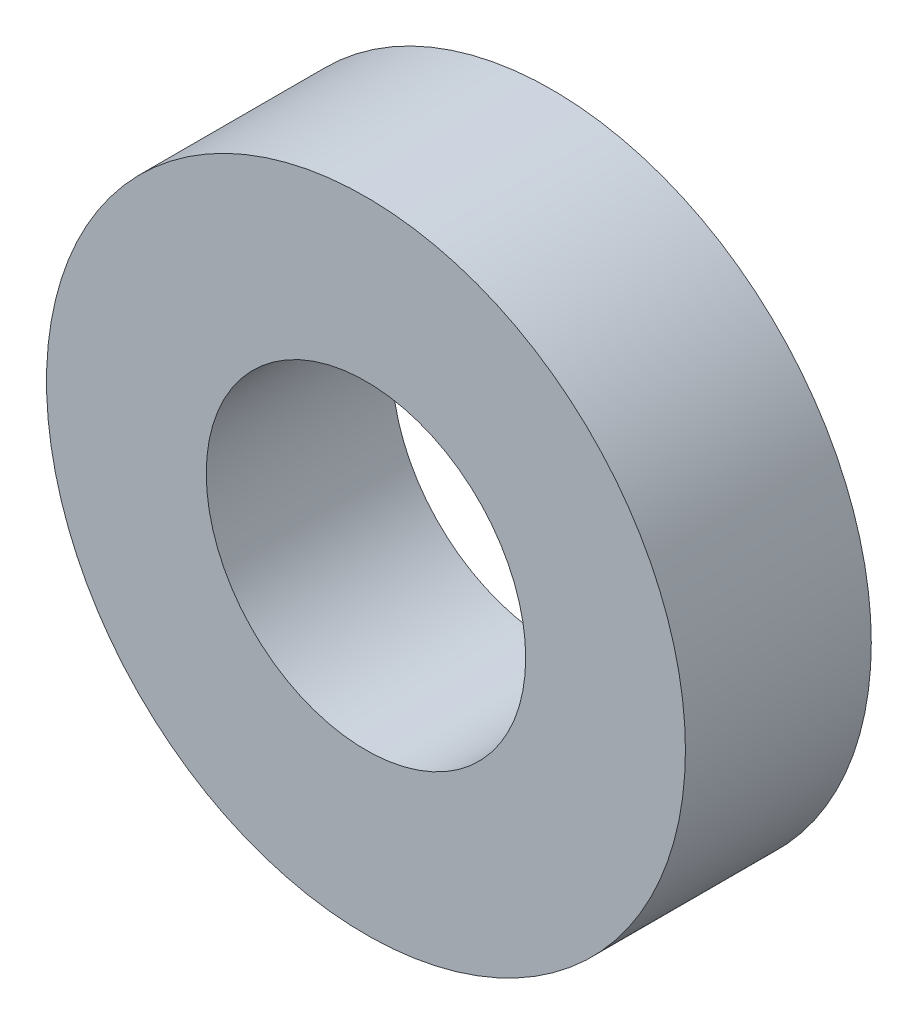
ISO-10303-21;
HEADER;
FILE_DESCRIPTION(('STEP AP214'),'2;1');
FILE_NAME('part.step','',(''),(''),'','','');
FILE_SCHEMA(('AUTOMOTIVE_DESIGN { 1 0 10303 214 1 1 1 1 }'));
ENDSEC;
DATA;
#1=APPLICATION_CONTEXT('core data for automotive mechanical design processes');
#2=APPLICATION_PROTOCOL_DEFINITION('international standard','automotive_design',2000,#1);
#3=PRODUCT_CONTEXT('',#1,'mechanical');
#4=PRODUCT('Part','Part','',(#3));
#5=PRODUCT_RELATED_PRODUCT_CATEGORY('part','',(#4));
#6=PRODUCT_DEFINITION_FORMATION('','',#4);
#7=PRODUCT_DEFINITION_CONTEXT('part definition',#1,'design');
#8=PRODUCT_DEFINITION('design','',#6,#7);
#9=PRODUCT_DEFINITION_SHAPE('','',#8);
#10=(LENGTH_UNIT() NAMED_UNIT(*) SI_UNIT(.MILLI.,.METRE.));
#11=(NAMED_UNIT(*) PLANE_ANGLE_UNIT() SI_UNIT($,.RADIAN.));
#12=(NAMED_UNIT(*) SI_UNIT($,.STERADIAN.) SOLID_ANGLE_UNIT());
#13=UNCERTAINTY_MEASURE_WITH_UNIT(LENGTH_MEASURE(1.E-05),#10,'distance_accuracy_value','');
#14=(GEOMETRIC_REPRESENTATION_CONTEXT(3) GLOBAL_UNCERTAINTY_ASSIGNED_CONTEXT((#13)) GLOBAL_UNIT_ASSIGNED_CONTEXT((#10,
#11,#12)) REPRESENTATION_CONTEXT('',''));
#15=CARTESIAN_POINT('',(0.,0.,0.));
#16=DIRECTION('',(0.,0.,1.));
#17=DIRECTION('',(1.,0.,0.));
#18=AXIS2_PLACEMENT_3D('',#15,#16,#17);
#19=CARTESIAN_POINT('',(0.,0.,3.2));
#20=DIRECTION('',(0.,0.,1.));
#21=DIRECTION('',(1.,0.,0.));
#22=AXIS2_PLACEMENT_3D('',#19,#20,#21);
#23=PLANE('',#22);
#24=CARTESIAN_POINT('',(0.,0.,3.2));
#25=DIRECTION('',(0.,0.,1.));
#26=DIRECTION('',(1.,0.,0.));
#27=AXIS2_PLACEMENT_3D('',#24,#25,#26);
#28=CIRCLE('',#27,5.5);
#29=CARTESIAN_POINT('',(5.5,0.,3.2));
#30=VERTEX_POINT('',#29);
#31=EDGE_CURVE('E10',#30,#30,#28,.T.);
#32=ORIENTED_EDGE('',*,*,#31,.T.);
#33=EDGE_LOOP('',(#32));
#34=FACE_BOUND('',#33,.T.);
#35=CARTESIAN_POINT('',(0.,0.,3.2));
#36=DIRECTION('',(0.,0.,1.));
#37=DIRECTION('',(1.,0.,0.));
#38=AXIS2_PLACEMENT_3D('',#35,#36,#37);
#39=CIRCLE('',#38,2.75);
#40=CARTESIAN_POINT('',(2.75,0.,3.2));
#41=VERTEX_POINT('',#40);
#42=EDGE_CURVE('E42',#41,#41,#39,.T.);
#43=ORIENTED_EDGE('',*,*,#42,.F.);
#44=EDGE_LOOP('',(#43));
#45=FACE_BOUND('',#44,.T.);
#46=ADVANCED_FACE('F31',(#34,#45),#23,.T.);
#47=CARTESIAN_POINT('',(0.,0.,0.));
#48=DIRECTION('',(0.,0.,1.));
#49=DIRECTION('',(1.,0.,0.));
#50=AXIS2_PLACEMENT_3D('',#47,#48,#49);
#51=PLANE('',#50);
#52=CARTESIAN_POINT('',(0.,0.,0.));
#53=DIRECTION('',(0.,0.,1.));
#54=DIRECTION('',(1.,0.,0.));
#55=AXIS2_PLACEMENT_3D('',#52,#53,#54);
#56=CIRCLE('',#55,5.5);
#57=CARTESIAN_POINT('',(5.5,0.,0.));
#58=VERTEX_POINT('',#57);
#59=EDGE_CURVE('E35',#58,#58,#56,.T.);
#60=ORIENTED_EDGE('',*,*,#59,.F.);
#61=EDGE_LOOP('',(#60));
#62=FACE_BOUND('',#61,.T.);
#63=CARTESIAN_POINT('',(0.,0.,0.));
#64=DIRECTION('',(0.,0.,1.));
#65=DIRECTION('',(1.,0.,0.));
#66=AXIS2_PLACEMENT_3D('',#63,#64,#65);
#67=CIRCLE('',#66,2.75);
#68=CARTESIAN_POINT('',(2.75,0.,0.));
#69=VERTEX_POINT('',#68);
#70=EDGE_CURVE('E44',#69,#69,#67,.T.);
#71=ORIENTED_EDGE('',*,*,#70,.T.);
#72=EDGE_LOOP('',(#71));
#73=FACE_BOUND('',#72,.T.);
#74=ADVANCED_FACE('F54',(#62,#73),#51,.F.);
#75=CARTESIAN_POINT('',(0.,0.,3.2));
#76=DIRECTION('',(0.,0.,-1.));
#77=DIRECTION('',(-1.,0.,0.));
#78=AXIS2_PLACEMENT_3D('',#75,#76,#77);
#79=CYLINDRICAL_SURFACE('',#78,5.5);
#80=ORIENTED_EDGE('',*,*,#31,.F.);
#81=EDGE_LOOP('',(#80));
#82=FACE_BOUND('',#81,.T.);
#83=ORIENTED_EDGE('',*,*,#59,.T.);
#84=EDGE_LOOP('',(#83));
#85=FACE_BOUND('',#84,.T.);
#86=ADVANCED_FACE('F33',(#82,#85),#79,.T.);
#87=CARTESIAN_POINT('',(0.,0.,3.2));
#88=DIRECTION('',(0.,0.,-1.));
#89=DIRECTION('',(-1.,0.,0.));
#90=AXIS2_PLACEMENT_3D('',#87,#88,#89);
#91=CYLINDRICAL_SURFACE('',#90,2.75);
#92=ORIENTED_EDGE('',*,*,#42,.T.);
#93=EDGE_LOOP('',(#92));
#94=FACE_BOUND('',#93,.T.);
#95=ORIENTED_EDGE('',*,*,#70,.F.);
#96=EDGE_LOOP('',(#95));
#97=FACE_BOUND('',#96,.T.);
#98=ADVANCED_FACE('F50',(#94,#97),#91,.F.);
#99=CLOSED_SHELL('',(#46,#74,#86,#98));
#100=MANIFOLD_SOLID_BREP('B2',#99);
#101=ADVANCED_BREP_SHAPE_REPRESENTATION('',(#18,#100),#14);
#102=SHAPE_DEFINITION_REPRESENTATION(#9,#101);
ENDSEC;
END-ISO-10303-21;
